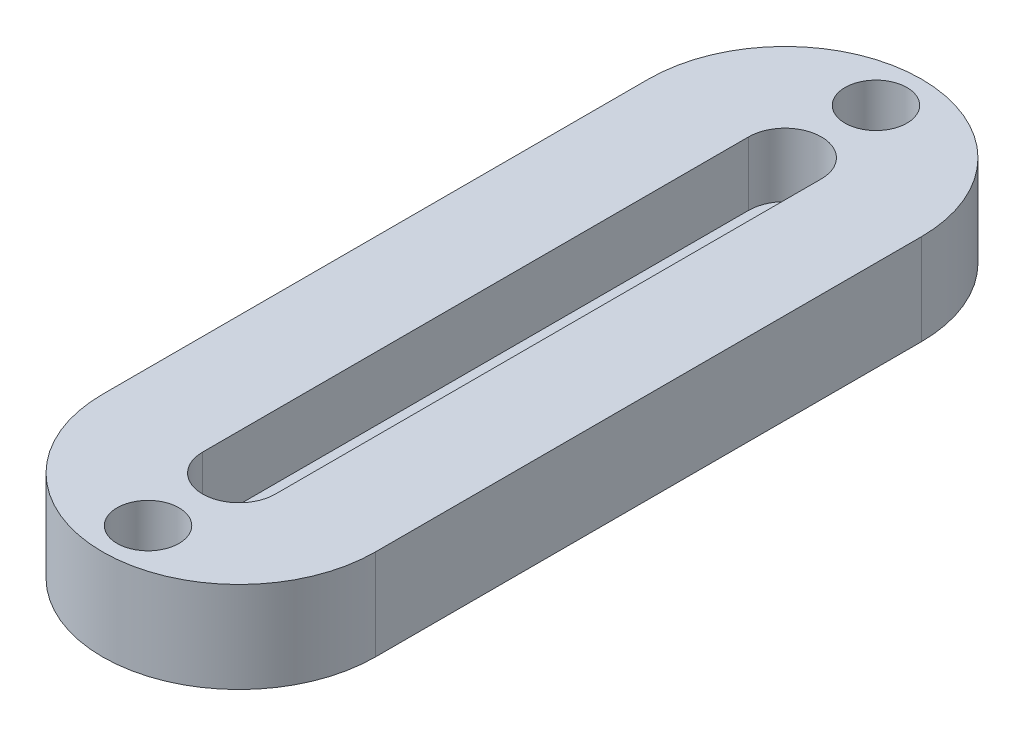
ISO-10303-21;
HEADER;
FILE_DESCRIPTION(('STEP AP214'),'2;1');
FILE_NAME('part.step','',(''),(''),'','','');
FILE_SCHEMA(('AUTOMOTIVE_DESIGN { 1 0 10303 214 1 1 1 1 }'));
ENDSEC;
DATA;
#1=APPLICATION_CONTEXT('core data for automotive mechanical design processes');
#2=APPLICATION_PROTOCOL_DEFINITION('international standard','automotive_design',2000,#1);
#3=PRODUCT_CONTEXT('',#1,'mechanical');
#4=PRODUCT('Part','Part','',(#3));
#5=PRODUCT_RELATED_PRODUCT_CATEGORY('part','',(#4));
#6=PRODUCT_DEFINITION_FORMATION('','',#4);
#7=PRODUCT_DEFINITION_CONTEXT('part definition',#1,'design');
#8=PRODUCT_DEFINITION('design','',#6,#7);
#9=PRODUCT_DEFINITION_SHAPE('','',#8);
#10=(LENGTH_UNIT() NAMED_UNIT(*) SI_UNIT(.MILLI.,.METRE.));
#11=(NAMED_UNIT(*) PLANE_ANGLE_UNIT() SI_UNIT($,.RADIAN.));
#12=(NAMED_UNIT(*) SI_UNIT($,.STERADIAN.) SOLID_ANGLE_UNIT());
#13=UNCERTAINTY_MEASURE_WITH_UNIT(LENGTH_MEASURE(1.E-05),#10,'distance_accuracy_value','');
#14=(GEOMETRIC_REPRESENTATION_CONTEXT(3) GLOBAL_UNCERTAINTY_ASSIGNED_CONTEXT((#13)) GLOBAL_UNIT_ASSIGNED_CONTEXT((#10,
#11,#12)) REPRESENTATION_CONTEXT('',''));
#15=CARTESIAN_POINT('',(0.,0.,0.));
#16=DIRECTION('',(0.,0.,1.));
#17=DIRECTION('',(1.,0.,0.));
#18=AXIS2_PLACEMENT_3D('',#15,#16,#17);
#19=CARTESIAN_POINT('',(2.54,6.35,0.));
#20=DIRECTION('',(0.,-1.,0.));
#21=DIRECTION('',(0.,0.,-1.));
#22=AXIS2_PLACEMENT_3D('',#19,#20,#21);
#23=CYLINDRICAL_SURFACE('',#22,2.54);
#24=DIRECTION('',(0.,-1.,0.));
#25=VECTOR('',#24,1.);
#26=CARTESIAN_POINT('',(5.08,6.35,0.));
#27=LINE('',#26,#25);
#28=CARTESIAN_POINT('',(5.08,6.35,0.));
#29=VERTEX_POINT('',#28);
#30=CARTESIAN_POINT('',(5.08,1.905,0.));
#31=VERTEX_POINT('',#30);
#32=EDGE_CURVE('E124',#29,#31,#27,.T.);
#33=ORIENTED_EDGE('',*,*,#32,.T.);
#34=CARTESIAN_POINT('',(2.54,1.905,0.));
#35=DIRECTION('',(0.,1.,0.));
#36=DIRECTION('',(0.,0.,1.));
#37=AXIS2_PLACEMENT_3D('',#34,#35,#36);
#38=CIRCLE('',#37,2.54);
#39=CARTESIAN_POINT('',(0.,1.905,0.));
#40=VERTEX_POINT('',#39);
#41=EDGE_CURVE('E113',#40,#31,#38,.T.);
#42=ORIENTED_EDGE('',*,*,#41,.F.);
#43=DIRECTION('',(0.,-1.,0.));
#44=VECTOR('',#43,1.);
#45=CARTESIAN_POINT('',(0.,6.35,0.));
#46=LINE('',#45,#44);
#47=CARTESIAN_POINT('',(0.,6.35,0.));
#48=VERTEX_POINT('',#47);
#49=EDGE_CURVE('E121',#48,#40,#46,.T.);
#50=ORIENTED_EDGE('',*,*,#49,.F.);
#51=CARTESIAN_POINT('',(2.54,6.35,0.));
#52=DIRECTION('',(0.,1.,0.));
#53=DIRECTION('',(0.,0.,1.));
#54=AXIS2_PLACEMENT_3D('',#51,#52,#53);
#55=CIRCLE('',#54,2.54);
#56=EDGE_CURVE('E204',#48,#29,#55,.T.);
#57=ORIENTED_EDGE('',*,*,#56,.T.);
#58=EDGE_LOOP('',(#33,#42,#50,#57));
#59=FACE_BOUND('',#58,.T.);
#60=ADVANCED_FACE('F45',(#59),#23,.F.);
#61=CARTESIAN_POINT('',(5.08,6.35,-38.1));
#62=DIRECTION('',(-1.,0.,0.));
#63=DIRECTION('',(0.,0.,1.));
#64=AXIS2_PLACEMENT_3D('',#61,#62,#63);
#65=PLANE('',#64);
#66=DIRECTION('',(0.,-1.,0.));
#67=VECTOR('',#66,1.);
#68=CARTESIAN_POINT('',(5.08,6.35,-38.1));
#69=LINE('',#68,#67);
#70=CARTESIAN_POINT('',(5.08,6.35,-38.1));
#71=VERTEX_POINT('',#70);
#72=CARTESIAN_POINT('',(5.08,1.905,-38.1));
#73=VERTEX_POINT('',#72);
#74=EDGE_CURVE('E135',#71,#73,#69,.T.);
#75=ORIENTED_EDGE('',*,*,#74,.T.);
#76=DIRECTION('',(0.,0.,-1.));
#77=VECTOR('',#76,1.);
#78=CARTESIAN_POINT('',(5.08,1.905,-38.1));
#79=LINE('',#78,#77);
#80=EDGE_CURVE('E126',#31,#73,#79,.T.);
#81=ORIENTED_EDGE('',*,*,#80,.F.);
#82=ORIENTED_EDGE('',*,*,#32,.F.);
#83=DIRECTION('',(0.,0.,-1.));
#84=VECTOR('',#83,1.);
#85=CARTESIAN_POINT('',(5.08,6.35,-38.1));
#86=LINE('',#85,#84);
#87=EDGE_CURVE('E207',#29,#71,#86,.T.);
#88=ORIENTED_EDGE('',*,*,#87,.T.);
#89=EDGE_LOOP('',(#75,#81,#82,#88));
#90=FACE_BOUND('',#89,.T.);
#91=ADVANCED_FACE('F218',(#90),#65,.T.);
#92=CARTESIAN_POINT('',(2.54,6.35,-38.1));
#93=DIRECTION('',(0.,-1.,0.));
#94=DIRECTION('',(0.,0.,-1.));
#95=AXIS2_PLACEMENT_3D('',#92,#93,#94);
#96=CYLINDRICAL_SURFACE('',#95,2.54);
#97=DIRECTION('',(0.,-1.,0.));
#98=VECTOR('',#97,1.);
#99=CARTESIAN_POINT('',(0.,6.35,-38.1));
#100=LINE('',#99,#98);
#101=CARTESIAN_POINT('',(0.,6.35,-38.1));
#102=VERTEX_POINT('',#101);
#103=CARTESIAN_POINT('',(0.,1.905,-38.1));
#104=VERTEX_POINT('',#103);
#105=EDGE_CURVE('E70',#102,#104,#100,.T.);
#106=ORIENTED_EDGE('',*,*,#105,.T.);
#107=CARTESIAN_POINT('',(2.54,1.905,-38.1));
#108=DIRECTION('',(0.,1.,0.));
#109=DIRECTION('',(0.,0.,-1.));
#110=AXIS2_PLACEMENT_3D('',#107,#108,#109);
#111=CIRCLE('',#110,2.54);
#112=EDGE_CURVE('E63',#73,#104,#111,.T.);
#113=ORIENTED_EDGE('',*,*,#112,.F.);
#114=ORIENTED_EDGE('',*,*,#74,.F.);
#115=CARTESIAN_POINT('',(2.54,6.35,-38.1));
#116=DIRECTION('',(0.,1.,0.));
#117=DIRECTION('',(0.,0.,-1.));
#118=AXIS2_PLACEMENT_3D('',#115,#116,#117);
#119=CIRCLE('',#118,2.54);
#120=EDGE_CURVE('E137',#71,#102,#119,.T.);
#121=ORIENTED_EDGE('',*,*,#120,.T.);
#122=EDGE_LOOP('',(#106,#113,#114,#121));
#123=FACE_BOUND('',#122,.T.);
#124=ADVANCED_FACE('F213',(#123),#96,.F.);
#125=CARTESIAN_POINT('',(0.,6.35,0.));
#126=DIRECTION('',(1.,0.,0.));
#127=DIRECTION('',(0.,0.,-1.));
#128=AXIS2_PLACEMENT_3D('',#125,#126,#127);
#129=PLANE('',#128);
#130=ORIENTED_EDGE('',*,*,#49,.T.);
#131=DIRECTION('',(0.,0.,1.));
#132=VECTOR('',#131,1.);
#133=CARTESIAN_POINT('',(0.,1.905,-38.1));
#134=LINE('',#133,#132);
#135=EDGE_CURVE('E110',#104,#40,#134,.T.);
#136=ORIENTED_EDGE('',*,*,#135,.F.);
#137=ORIENTED_EDGE('',*,*,#105,.F.);
#138=DIRECTION('',(0.,0.,1.));
#139=VECTOR('',#138,1.);
#140=CARTESIAN_POINT('',(0.,6.35,0.));
#141=LINE('',#140,#139);
#142=EDGE_CURVE('E130',#102,#48,#141,.T.);
#143=ORIENTED_EDGE('',*,*,#142,.T.);
#144=EDGE_LOOP('',(#130,#136,#137,#143));
#145=FACE_BOUND('',#144,.T.);
#146=ADVANCED_FACE('F128',(#145),#129,.T.);
#147=CARTESIAN_POINT('',(2.54,6.35,-38.1));
#148=DIRECTION('',(0.,-1.,0.));
#149=DIRECTION('',(0.,0.,-1.));
#150=AXIS2_PLACEMENT_3D('',#147,#148,#149);
#151=PLANE('',#150);
#152=CARTESIAN_POINT('',(2.54,6.35,-44.45));
#153=DIRECTION('',(0.,1.,0.));
#154=DIRECTION('',(0.,0.,1.));
#155=AXIS2_PLACEMENT_3D('',#152,#153,#154);
#156=CIRCLE('',#155,2.159);
#157=CARTESIAN_POINT('',(2.54,6.35,-42.291));
#158=VERTEX_POINT('',#157);
#159=EDGE_CURVE('E185',#158,#158,#156,.T.);
#160=ORIENTED_EDGE('',*,*,#159,.F.);
#161=EDGE_LOOP('',(#160));
#162=FACE_BOUND('',#161,.T.);
#163=CARTESIAN_POINT('',(2.54,6.35,6.35));
#164=DIRECTION('',(0.,1.,0.));
#165=DIRECTION('',(0.,0.,1.));
#166=AXIS2_PLACEMENT_3D('',#163,#164,#165);
#167=CIRCLE('',#166,2.159);
#168=CARTESIAN_POINT('',(2.54,6.35,8.509));
#169=VERTEX_POINT('',#168);
#170=EDGE_CURVE('E192',#169,#169,#167,.T.);
#171=ORIENTED_EDGE('',*,*,#170,.F.);
#172=EDGE_LOOP('',(#171));
#173=FACE_BOUND('',#172,.T.);
#174=CARTESIAN_POINT('',(2.54,6.35,-38.1));
#175=DIRECTION('',(0.,1.,0.));
#176=DIRECTION('',(0.,0.,-1.));
#177=AXIS2_PLACEMENT_3D('',#174,#175,#176);
#178=CIRCLE('',#177,9.525);
#179=CARTESIAN_POINT('',(12.065,6.35,-38.1));
#180=VERTEX_POINT('',#179);
#181=CARTESIAN_POINT('',(-6.985,6.35,-38.1));
#182=VERTEX_POINT('',#181);
#183=EDGE_CURVE('E147',#180,#182,#178,.T.);
#184=ORIENTED_EDGE('',*,*,#183,.T.);
#185=DIRECTION('',(0.,0.,1.));
#186=VECTOR('',#185,1.);
#187=CARTESIAN_POINT('',(-6.985,6.35,-38.1));
#188=LINE('',#187,#186);
#189=CARTESIAN_POINT('',(-6.985,6.35,0.));
#190=VERTEX_POINT('',#189);
#191=EDGE_CURVE('E151',#182,#190,#188,.T.);
#192=ORIENTED_EDGE('',*,*,#191,.T.);
#193=CARTESIAN_POINT('',(2.54,6.35,0.));
#194=DIRECTION('',(0.,1.,0.));
#195=DIRECTION('',(0.,0.,1.));
#196=AXIS2_PLACEMENT_3D('',#193,#194,#195);
#197=CIRCLE('',#196,9.525);
#198=CARTESIAN_POINT('',(12.065,6.35,0.));
#199=VERTEX_POINT('',#198);
#200=EDGE_CURVE('E155',#190,#199,#197,.T.);
#201=ORIENTED_EDGE('',*,*,#200,.T.);
#202=DIRECTION('',(0.,0.,-1.));
#203=VECTOR('',#202,1.);
#204=CARTESIAN_POINT('',(12.065,6.35,-38.1));
#205=LINE('',#204,#203);
#206=EDGE_CURVE('E158',#199,#180,#205,.T.);
#207=ORIENTED_EDGE('',*,*,#206,.T.);
#208=EDGE_LOOP('',(#184,#192,#201,#207));
#209=FACE_BOUND('',#208,.T.);
#210=ORIENTED_EDGE('',*,*,#56,.F.);
#211=ORIENTED_EDGE('',*,*,#142,.F.);
#212=ORIENTED_EDGE('',*,*,#120,.F.);
#213=ORIENTED_EDGE('',*,*,#87,.F.);
#214=EDGE_LOOP('',(#210,#211,#212,#213));
#215=FACE_BOUND('',#214,.T.);
#216=ADVANCED_FACE('F216',(#162,#173,#209,#215),#151,.F.);
#217=CARTESIAN_POINT('',(2.54,0.,-38.1));
#218=DIRECTION('',(0.,-1.,0.));
#219=DIRECTION('',(0.,0.,-1.));
#220=AXIS2_PLACEMENT_3D('',#217,#218,#219);
#221=PLANE('',#220);
#222=CARTESIAN_POINT('',(2.54,0.,-44.45));
#223=DIRECTION('',(0.,-1.,0.));
#224=DIRECTION('',(0.,0.,-1.));
#225=AXIS2_PLACEMENT_3D('',#222,#223,#224);
#226=CIRCLE('',#225,2.159);
#227=CARTESIAN_POINT('',(2.54,0.,-46.609));
#228=VERTEX_POINT('',#227);
#229=EDGE_CURVE('E49',#228,#228,#226,.T.);
#230=ORIENTED_EDGE('',*,*,#229,.F.);
#231=EDGE_LOOP('',(#230));
#232=FACE_BOUND('',#231,.T.);
#233=CARTESIAN_POINT('',(2.54,0.,6.35));
#234=DIRECTION('',(0.,-1.,0.));
#235=DIRECTION('',(0.,0.,-1.));
#236=AXIS2_PLACEMENT_3D('',#233,#234,#235);
#237=CIRCLE('',#236,2.159);
#238=CARTESIAN_POINT('',(2.54,0.,4.191));
#239=VERTEX_POINT('',#238);
#240=EDGE_CURVE('E182',#239,#239,#237,.T.);
#241=ORIENTED_EDGE('',*,*,#240,.F.);
#242=EDGE_LOOP('',(#241));
#243=FACE_BOUND('',#242,.T.);
#244=CARTESIAN_POINT('',(2.54,0.,-38.1));
#245=DIRECTION('',(0.,1.,0.));
#246=DIRECTION('',(0.,0.,-1.));
#247=AXIS2_PLACEMENT_3D('',#244,#245,#246);
#248=CIRCLE('',#247,9.525);
#249=CARTESIAN_POINT('',(12.065,0.,-38.1));
#250=VERTEX_POINT('',#249);
#251=CARTESIAN_POINT('',(-6.985,0.,-38.1));
#252=VERTEX_POINT('',#251);
#253=EDGE_CURVE('E146',#250,#252,#248,.T.);
#254=ORIENTED_EDGE('',*,*,#253,.F.);
#255=DIRECTION('',(0.,0.,-1.));
#256=VECTOR('',#255,1.);
#257=CARTESIAN_POINT('',(12.065,0.,-38.1));
#258=LINE('',#257,#256);
#259=CARTESIAN_POINT('',(12.065,0.,0.));
#260=VERTEX_POINT('',#259);
#261=EDGE_CURVE('E152',#260,#250,#258,.T.);
#262=ORIENTED_EDGE('',*,*,#261,.F.);
#263=CARTESIAN_POINT('',(2.54,0.,0.));
#264=DIRECTION('',(0.,1.,0.));
#265=DIRECTION('',(0.,0.,1.));
#266=AXIS2_PLACEMENT_3D('',#263,#264,#265);
#267=CIRCLE('',#266,9.525);
#268=CARTESIAN_POINT('',(-6.985,0.,0.));
#269=VERTEX_POINT('',#268);
#270=EDGE_CURVE('E168',#269,#260,#267,.T.);
#271=ORIENTED_EDGE('',*,*,#270,.F.);
#272=DIRECTION('',(0.,0.,1.));
#273=VECTOR('',#272,1.);
#274=CARTESIAN_POINT('',(-6.985,0.,-38.1));
#275=LINE('',#274,#273);
#276=EDGE_CURVE('E165',#252,#269,#275,.T.);
#277=ORIENTED_EDGE('',*,*,#276,.F.);
#278=EDGE_LOOP('',(#254,#262,#271,#277));
#279=FACE_BOUND('',#278,.T.);
#280=ADVANCED_FACE('F231',(#232,#243,#279),#221,.T.);
#281=CARTESIAN_POINT('',(2.54,6.35,-38.1));
#282=DIRECTION('',(0.,-1.,0.));
#283=DIRECTION('',(0.,0.,-1.));
#284=AXIS2_PLACEMENT_3D('',#281,#282,#283);
#285=CYLINDRICAL_SURFACE('',#284,9.525);
#286=ORIENTED_EDGE('',*,*,#253,.T.);
#287=DIRECTION('',(0.,-1.,0.));
#288=VECTOR('',#287,1.);
#289=CARTESIAN_POINT('',(-6.985,6.35,-38.1));
#290=LINE('',#289,#288);
#291=EDGE_CURVE('E11',#182,#252,#290,.T.);
#292=ORIENTED_EDGE('',*,*,#291,.F.);
#293=ORIENTED_EDGE('',*,*,#183,.F.);
#294=DIRECTION('',(0.,-1.,0.));
#295=VECTOR('',#294,1.);
#296=CARTESIAN_POINT('',(12.065,6.35,-38.1));
#297=LINE('',#296,#295);
#298=EDGE_CURVE('E161',#180,#250,#297,.T.);
#299=ORIENTED_EDGE('',*,*,#298,.T.);
#300=EDGE_LOOP('',(#286,#292,#293,#299));
#301=FACE_BOUND('',#300,.T.);
#302=ADVANCED_FACE('F47',(#301),#285,.T.);
#303=CARTESIAN_POINT('',(-6.985,6.35,-38.1));
#304=DIRECTION('',(1.,0.,0.));
#305=DIRECTION('',(0.,0.,-1.));
#306=AXIS2_PLACEMENT_3D('',#303,#304,#305);
#307=PLANE('',#306);
#308=ORIENTED_EDGE('',*,*,#276,.T.);
#309=DIRECTION('',(0.,-1.,0.));
#310=VECTOR('',#309,1.);
#311=CARTESIAN_POINT('',(-6.985,6.35,0.));
#312=LINE('',#311,#310);
#313=EDGE_CURVE('E55',#190,#269,#312,.T.);
#314=ORIENTED_EDGE('',*,*,#313,.F.);
#315=ORIENTED_EDGE('',*,*,#191,.F.);
#316=ORIENTED_EDGE('',*,*,#291,.T.);
#317=EDGE_LOOP('',(#308,#314,#315,#316));
#318=FACE_BOUND('',#317,.T.);
#319=ADVANCED_FACE('F242',(#318),#307,.F.);
#320=CARTESIAN_POINT('',(2.54,6.35,0.));
#321=DIRECTION('',(0.,-1.,0.));
#322=DIRECTION('',(0.,0.,-1.));
#323=AXIS2_PLACEMENT_3D('',#320,#321,#322);
#324=CYLINDRICAL_SURFACE('',#323,9.525);
#325=ORIENTED_EDGE('',*,*,#270,.T.);
#326=DIRECTION('',(0.,-1.,0.));
#327=VECTOR('',#326,1.);
#328=CARTESIAN_POINT('',(12.065,6.35,0.));
#329=LINE('',#328,#327);
#330=EDGE_CURVE('E176',#199,#260,#329,.T.);
#331=ORIENTED_EDGE('',*,*,#330,.F.);
#332=ORIENTED_EDGE('',*,*,#200,.F.);
#333=ORIENTED_EDGE('',*,*,#313,.T.);
#334=EDGE_LOOP('',(#325,#331,#332,#333));
#335=FACE_BOUND('',#334,.T.);
#336=ADVANCED_FACE('F239',(#335),#324,.T.);
#337=CARTESIAN_POINT('',(12.065,6.35,-38.1));
#338=DIRECTION('',(-1.,0.,0.));
#339=DIRECTION('',(0.,0.,1.));
#340=AXIS2_PLACEMENT_3D('',#337,#338,#339);
#341=PLANE('',#340);
#342=ORIENTED_EDGE('',*,*,#261,.T.);
#343=ORIENTED_EDGE('',*,*,#298,.F.);
#344=ORIENTED_EDGE('',*,*,#206,.F.);
#345=ORIENTED_EDGE('',*,*,#330,.T.);
#346=EDGE_LOOP('',(#342,#343,#344,#345));
#347=FACE_BOUND('',#346,.T.);
#348=ADVANCED_FACE('F236',(#347),#341,.F.);
#349=CARTESIAN_POINT('',(2.54,1.905,-38.1));
#350=DIRECTION('',(0.,-1.,0.));
#351=DIRECTION('',(0.,0.,-1.));
#352=AXIS2_PLACEMENT_3D('',#349,#350,#351);
#353=PLANE('',#352);
#354=ORIENTED_EDGE('',*,*,#112,.T.);
#355=ORIENTED_EDGE('',*,*,#135,.T.);
#356=ORIENTED_EDGE('',*,*,#41,.T.);
#357=ORIENTED_EDGE('',*,*,#80,.T.);
#358=EDGE_LOOP('',(#354,#355,#356,#357));
#359=FACE_BOUND('',#358,.T.);
#360=ADVANCED_FACE('F112',(#359),#353,.F.);
#361=CARTESIAN_POINT('',(2.54,-6.35,6.35));
#362=DIRECTION('',(0.,1.,0.));
#363=DIRECTION('',(0.,0.,1.));
#364=AXIS2_PLACEMENT_3D('',#361,#362,#363);
#365=CYLINDRICAL_SURFACE('',#364,2.159);
#366=ORIENTED_EDGE('',*,*,#240,.T.);
#367=EDGE_LOOP('',(#366));
#368=FACE_BOUND('',#367,.T.);
#369=ORIENTED_EDGE('',*,*,#170,.T.);
#370=EDGE_LOOP('',(#369));
#371=FACE_BOUND('',#370,.T.);
#372=ADVANCED_FACE('F320',(#368,#371),#365,.F.);
#373=CARTESIAN_POINT('',(2.54,-6.35,-44.45));
#374=DIRECTION('',(0.,1.,0.));
#375=DIRECTION('',(0.,0.,1.));
#376=AXIS2_PLACEMENT_3D('',#373,#374,#375);
#377=CYLINDRICAL_SURFACE('',#376,2.159);
#378=ORIENTED_EDGE('',*,*,#229,.T.);
#379=EDGE_LOOP('',(#378));
#380=FACE_BOUND('',#379,.T.);
#381=ORIENTED_EDGE('',*,*,#159,.T.);
#382=EDGE_LOOP('',(#381));
#383=FACE_BOUND('',#382,.T.);
#384=ADVANCED_FACE('F328',(#380,#383),#377,.F.);
#385=CLOSED_SHELL('',(#60,#91,#124,#146,#216,#280,#302,#319,#336,#348,#360,#372,#384));
#386=MANIFOLD_SOLID_BREP('B2',#385);
#387=ADVANCED_BREP_SHAPE_REPRESENTATION('',(#18,#386),#14);
#388=SHAPE_DEFINITION_REPRESENTATION(#9,#387);
ENDSEC;
END-ISO-10303-21;
